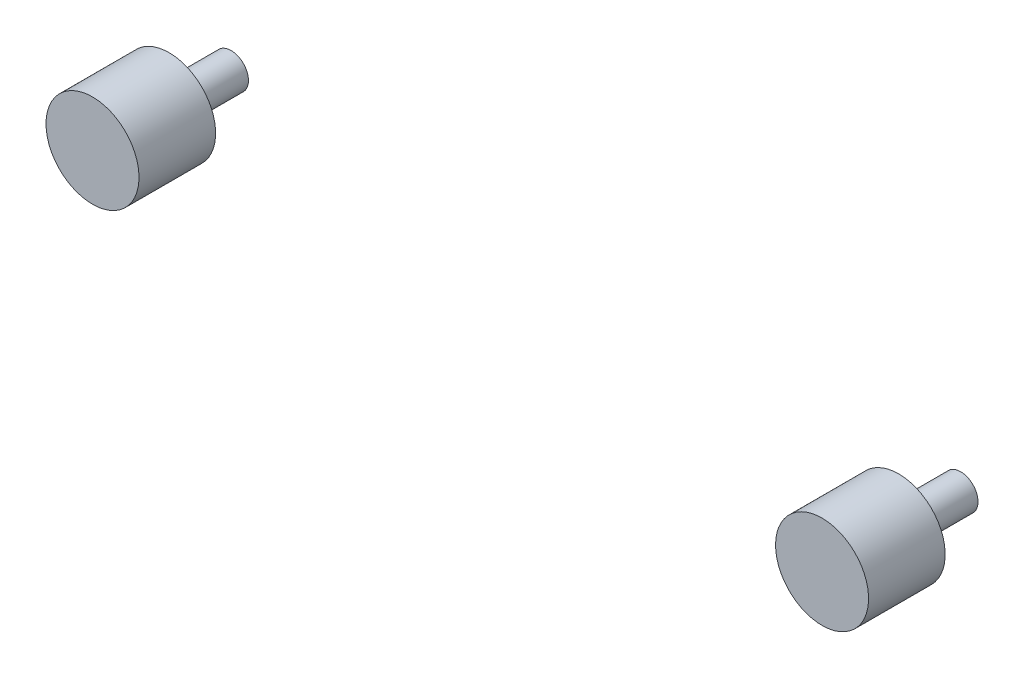
ISO-10303-21;
HEADER;
FILE_DESCRIPTION(('STEP AP214'),'2;1');
FILE_NAME('part.step','',(''),(''),'','','');
FILE_SCHEMA(('AUTOMOTIVE_DESIGN { 1 0 10303 214 1 1 1 1 }'));
ENDSEC;
DATA;
#1=APPLICATION_CONTEXT('core data for automotive mechanical design processes');
#2=APPLICATION_PROTOCOL_DEFINITION('international standard','automotive_design',2000,#1);
#3=PRODUCT_CONTEXT('',#1,'mechanical');
#4=PRODUCT('Part','Part','',(#3));
#5=PRODUCT_RELATED_PRODUCT_CATEGORY('part','',(#4));
#6=PRODUCT_DEFINITION_FORMATION('','',#4);
#7=PRODUCT_DEFINITION_CONTEXT('part definition',#1,'design');
#8=PRODUCT_DEFINITION('design','',#6,#7);
#9=PRODUCT_DEFINITION_SHAPE('','',#8);
#10=(LENGTH_UNIT() NAMED_UNIT(*) SI_UNIT(.MILLI.,.METRE.));
#11=(NAMED_UNIT(*) PLANE_ANGLE_UNIT() SI_UNIT($,.RADIAN.));
#12=(NAMED_UNIT(*) SI_UNIT($,.STERADIAN.) SOLID_ANGLE_UNIT());
#13=UNCERTAINTY_MEASURE_WITH_UNIT(LENGTH_MEASURE(1.E-05),#10,'distance_accuracy_value','');
#14=(GEOMETRIC_REPRESENTATION_CONTEXT(3) GLOBAL_UNCERTAINTY_ASSIGNED_CONTEXT((#13)) GLOBAL_UNIT_ASSIGNED_CONTEXT((#10,
#11,#12)) REPRESENTATION_CONTEXT('',''));
#15=CARTESIAN_POINT('',(0.,0.,0.));
#16=DIRECTION('',(0.,0.,1.));
#17=DIRECTION('',(1.,0.,0.));
#18=AXIS2_PLACEMENT_3D('',#15,#16,#17);
#19=CARTESIAN_POINT('',(100.,60.,21.));
#20=DIRECTION('',(0.,0.,-1.));
#21=DIRECTION('',(-1.,0.,0.));
#22=AXIS2_PLACEMENT_3D('',#19,#20,#21);
#23=CYLINDRICAL_SURFACE('',#22,12.75);
#24=CARTESIAN_POINT('',(100.,60.,21.));
#25=DIRECTION('',(0.,0.,1.));
#26=DIRECTION('',(1.,0.,0.));
#27=AXIS2_PLACEMENT_3D('',#24,#25,#26);
#28=CIRCLE('',#27,12.75);
#29=CARTESIAN_POINT('',(87.25,60.,21.));
#30=VERTEX_POINT('',#29);
#31=EDGE_CURVE('E51',#30,#30,#28,.T.);
#32=CARTESIAN_POINT('',(100.,60.,0.));
#33=DIRECTION('',(0.,0.,1.));
#34=DIRECTION('',(1.,0.,0.));
#35=AXIS2_PLACEMENT_3D('',#32,#33,#34);
#36=CIRCLE('',#35,12.75);
#37=CARTESIAN_POINT('',(87.25,60.,0.));
#38=VERTEX_POINT('',#37);
#39=EDGE_CURVE('E11',#38,#38,#36,.T.);
#40=CARTESIAN_POINT('',(87.25,60.,21.));
#41=CARTESIAN_POINT('',(87.25,60.,20.78125));
#42=CARTESIAN_POINT('',(87.25,60.,20.5625));
#43=CARTESIAN_POINT('',(87.25,60.,20.125));
#44=CARTESIAN_POINT('',(87.25,60.,19.90625));
#45=CARTESIAN_POINT('',(87.25,60.,19.46875));
#46=CARTESIAN_POINT('',(87.25,60.,19.25));
#47=CARTESIAN_POINT('',(87.25,60.,18.8125));
#48=CARTESIAN_POINT('',(87.25,60.,18.59375));
#49=CARTESIAN_POINT('',(87.25,60.,18.15625));
#50=CARTESIAN_POINT('',(87.25,60.,17.9375));
#51=CARTESIAN_POINT('',(87.25,60.,17.5));
#52=CARTESIAN_POINT('',(87.25,60.,17.28125));
#53=CARTESIAN_POINT('',(87.25,60.,16.84375));
#54=CARTESIAN_POINT('',(87.25,60.,16.625));
#55=CARTESIAN_POINT('',(87.25,60.,16.1875));
#56=CARTESIAN_POINT('',(87.25,60.,15.96875));
#57=CARTESIAN_POINT('',(87.25,60.,15.53125));
#58=CARTESIAN_POINT('',(87.25,60.,15.3125));
#59=CARTESIAN_POINT('',(87.25,60.,14.875));
#60=CARTESIAN_POINT('',(87.25,60.,14.65625));
#61=CARTESIAN_POINT('',(87.25,60.,14.21875));
#62=CARTESIAN_POINT('',(87.25,60.,14.));
#63=CARTESIAN_POINT('',(87.25,60.,13.5625));
#64=CARTESIAN_POINT('',(87.25,60.,13.34375));
#65=CARTESIAN_POINT('',(87.25,60.,12.90625));
#66=CARTESIAN_POINT('',(87.25,60.,12.6875));
#67=CARTESIAN_POINT('',(87.25,60.,12.25));
#68=CARTESIAN_POINT('',(87.25,60.,12.03125));
#69=CARTESIAN_POINT('',(87.25,60.,11.59375));
#70=CARTESIAN_POINT('',(87.25,60.,11.375));
#71=CARTESIAN_POINT('',(87.25,60.,10.9375));
#72=CARTESIAN_POINT('',(87.25,60.,10.71875));
#73=CARTESIAN_POINT('',(87.25,60.,10.28125));
#74=CARTESIAN_POINT('',(87.25,60.,10.0625));
#75=CARTESIAN_POINT('',(87.25,60.,9.625));
#76=CARTESIAN_POINT('',(87.25,60.,9.40625));
#77=CARTESIAN_POINT('',(87.25,60.,8.96875));
#78=CARTESIAN_POINT('',(87.25,60.,8.75));
#79=CARTESIAN_POINT('',(87.25,60.,8.3125));
#80=CARTESIAN_POINT('',(87.25,60.,8.09375));
#81=CARTESIAN_POINT('',(87.25,60.,7.65625));
#82=CARTESIAN_POINT('',(87.25,60.,7.4375));
#83=CARTESIAN_POINT('',(87.25,60.,7.));
#84=CARTESIAN_POINT('',(87.25,60.,6.78125));
#85=CARTESIAN_POINT('',(87.25,60.,6.34375));
#86=CARTESIAN_POINT('',(87.25,60.,6.125));
#87=CARTESIAN_POINT('',(87.25,60.,5.6875));
#88=CARTESIAN_POINT('',(87.25,60.,5.46875));
#89=CARTESIAN_POINT('',(87.25,60.,5.03125));
#90=CARTESIAN_POINT('',(87.25,60.,4.8125));
#91=CARTESIAN_POINT('',(87.25,60.,4.375));
#92=CARTESIAN_POINT('',(87.25,60.,4.15625));
#93=CARTESIAN_POINT('',(87.25,60.,3.71875));
#94=CARTESIAN_POINT('',(87.25,60.,3.5));
#95=CARTESIAN_POINT('',(87.25,60.,3.0625));
#96=CARTESIAN_POINT('',(87.25,60.,2.84375));
#97=CARTESIAN_POINT('',(87.25,60.,2.40625));
#98=CARTESIAN_POINT('',(87.25,60.,2.1875));
#99=CARTESIAN_POINT('',(87.25,60.,1.75));
#100=CARTESIAN_POINT('',(87.25,60.,1.53125));
#101=CARTESIAN_POINT('',(87.25,60.,1.09375));
#102=CARTESIAN_POINT('',(87.25,60.,0.875000000000001));
#103=CARTESIAN_POINT('',(87.25,60.,0.4375));
#104=CARTESIAN_POINT('',(87.25,60.,0.21875));
#105=CARTESIAN_POINT('',(87.25,60.,0.));
#106=B_SPLINE_CURVE_WITH_KNOTS('',3,(#40,#41,#42,#43,#44,#45,#46,#47,#48,#49,#50,#51,#52,#53,
#54,#55,#56,#57,#58,#59,#60,#61,#62,#63,#64,#65,#66,#67,#68,#69,#70,#71,#72,#73,#74,#75,#76,#77,
#78,#79,#80,#81,#82,#83,#84,#85,#86,#87,#88,#89,#90,#91,#92,#93,#94,#95,#96,#97,#98,#99,#100,
#101,#102,#103,#104,#105),.UNSPECIFIED.,.F.,.F.,(4,2,2,2,2,2,2,2,2,2,2,2,2,2,2,2,2,2,2,2,2,2,2,
2,2,2,2,2,2,2,2,2,4),(0.,0.656249999999997,1.3125,1.96875,2.625,3.28125,3.9375,4.59375,5.25,
5.90625,6.5625,7.21875,7.875,8.53125,9.1875,9.84375,10.5,11.15625,11.8125,12.46875,13.125,
13.78125,14.4375,15.09375,15.75,16.40625,17.0625,17.71875,18.375,19.03125,19.6875,20.34375,21.),.UNSPECIFIED.);
#107=EDGE_CURVE('BSEAM50',#30,#38,#106,.T.);
#108=ORIENTED_EDGE('',*,*,#31,.F.);
#109=ORIENTED_EDGE('',*,*,#39,.T.);
#110=ORIENTED_EDGE('',*,*,#107,.T.);
#111=ORIENTED_EDGE('',*,*,#107,.F.);
#112=EDGE_LOOP('',(#108,#110,#109,#111));
#113=FACE_BOUND('',#112,.T.);
#114=ADVANCED_FACE('F50',(#113),#23,.T.);
#115=CARTESIAN_POINT('',(100.,60.,21.));
#116=DIRECTION('',(0.,0.,1.));
#117=DIRECTION('',(1.,0.,0.));
#118=AXIS2_PLACEMENT_3D('',#115,#116,#117);
#119=PLANE('',#118);
#120=ORIENTED_EDGE('',*,*,#31,.T.);
#121=EDGE_LOOP('',(#120));
#122=FACE_BOUND('',#121,.T.);
#123=ADVANCED_FACE('F47',(#122),#119,.T.);
#124=CARTESIAN_POINT('',(100.,60.,0.));
#125=DIRECTION('',(0.,0.,1.));
#126=DIRECTION('',(1.,0.,0.));
#127=AXIS2_PLACEMENT_3D('',#124,#125,#126);
#128=PLANE('',#127);
#129=CARTESIAN_POINT('',(100.,60.,0.));
#130=DIRECTION('',(0.,0.,1.));
#131=DIRECTION('',(1.,0.,0.));
#132=AXIS2_PLACEMENT_3D('',#129,#130,#131);
#133=CIRCLE('',#132,4.75);
#134=CARTESIAN_POINT('',(104.75,60.,0.));
#135=VERTEX_POINT('',#134);
#136=EDGE_CURVE('E58',#135,#135,#133,.T.);
#137=ORIENTED_EDGE('',*,*,#136,.T.);
#138=EDGE_LOOP('',(#137));
#139=FACE_BOUND('',#138,.T.);
#140=ORIENTED_EDGE('',*,*,#39,.F.);
#141=EDGE_LOOP('',(#140));
#142=FACE_BOUND('',#141,.T.);
#143=ADVANCED_FACE('F71',(#139,#142),#128,.F.);
#144=CARTESIAN_POINT('',(100.,60.,0.));
#145=DIRECTION('',(0.,0.,-1.));
#146=DIRECTION('',(-1.,0.,0.));
#147=AXIS2_PLACEMENT_3D('',#144,#145,#146);
#148=CYLINDRICAL_SURFACE('',#147,4.75);
#149=ORIENTED_EDGE('',*,*,#136,.F.);
#150=EDGE_LOOP('',(#149));
#151=FACE_BOUND('',#150,.T.);
#152=CARTESIAN_POINT('',(100.,60.,-17.));
#153=DIRECTION('',(0.,0.,1.));
#154=DIRECTION('',(1.,0.,0.));
#155=AXIS2_PLACEMENT_3D('',#152,#153,#154);
#156=CIRCLE('',#155,4.75);
#157=CARTESIAN_POINT('',(104.75,60.,-17.));
#158=VERTEX_POINT('',#157);
#159=EDGE_CURVE('E59',#158,#158,#156,.T.);
#160=ORIENTED_EDGE('',*,*,#159,.T.);
#161=EDGE_LOOP('',(#160));
#162=FACE_BOUND('',#161,.T.);
#163=ADVANCED_FACE('F67',(#151,#162),#148,.T.);
#164=CARTESIAN_POINT('',(100.,60.,-17.));
#165=DIRECTION('',(0.,0.,1.));
#166=DIRECTION('',(1.,0.,0.));
#167=AXIS2_PLACEMENT_3D('',#164,#165,#166);
#168=PLANE('',#167);
#169=ORIENTED_EDGE('',*,*,#159,.F.);
#170=EDGE_LOOP('',(#169));
#171=FACE_BOUND('',#170,.T.);
#172=ADVANCED_FACE('F68',(#171),#168,.F.);
#173=CLOSED_SHELL('',(#114,#123,#143,#163,#172));
#174=MANIFOLD_SOLID_BREP('B2',#173);
#175=CARTESIAN_POINT('',(-100.,60.,21.));
#176=DIRECTION('',(0.,0.,-1.));
#177=DIRECTION('',(-1.,0.,0.));
#178=AXIS2_PLACEMENT_3D('',#175,#176,#177);
#179=CYLINDRICAL_SURFACE('',#178,12.75);
#180=CARTESIAN_POINT('',(-100.,60.,21.));
#181=DIRECTION('',(0.,0.,1.));
#182=DIRECTION('',(1.,0.,0.));
#183=AXIS2_PLACEMENT_3D('',#180,#181,#182);
#184=CIRCLE('',#183,12.75);
#185=CARTESIAN_POINT('',(-112.75,60.,21.));
#186=VERTEX_POINT('',#185);
#187=EDGE_CURVE('E46',#186,#186,#184,.T.);
#188=CARTESIAN_POINT('',(-100.,60.,0.));
#189=DIRECTION('',(0.,0.,1.));
#190=DIRECTION('',(1.,0.,0.));
#191=AXIS2_PLACEMENT_3D('',#188,#189,#190);
#192=CIRCLE('',#191,12.75);
#193=CARTESIAN_POINT('',(-112.75,60.,0.));
#194=VERTEX_POINT('',#193);
#195=EDGE_CURVE('E122',#194,#194,#192,.T.);
#196=CARTESIAN_POINT('',(-112.75,60.,21.));
#197=CARTESIAN_POINT('',(-112.75,60.,20.78125));
#198=CARTESIAN_POINT('',(-112.75,60.,20.5625));
#199=CARTESIAN_POINT('',(-112.75,60.,20.125));
#200=CARTESIAN_POINT('',(-112.75,60.,19.90625));
#201=CARTESIAN_POINT('',(-112.75,60.,19.46875));
#202=CARTESIAN_POINT('',(-112.75,60.,19.25));
#203=CARTESIAN_POINT('',(-112.75,60.,18.8125));
#204=CARTESIAN_POINT('',(-112.75,60.,18.59375));
#205=CARTESIAN_POINT('',(-112.75,60.,18.15625));
#206=CARTESIAN_POINT('',(-112.75,60.,17.9375));
#207=CARTESIAN_POINT('',(-112.75,60.,17.5));
#208=CARTESIAN_POINT('',(-112.75,60.,17.28125));
#209=CARTESIAN_POINT('',(-112.75,60.,16.84375));
#210=CARTESIAN_POINT('',(-112.75,60.,16.625));
#211=CARTESIAN_POINT('',(-112.75,60.,16.1875));
#212=CARTESIAN_POINT('',(-112.75,60.,15.96875));
#213=CARTESIAN_POINT('',(-112.75,60.,15.53125));
#214=CARTESIAN_POINT('',(-112.75,60.,15.3125));
#215=CARTESIAN_POINT('',(-112.75,60.,14.875));
#216=CARTESIAN_POINT('',(-112.75,60.,14.65625));
#217=CARTESIAN_POINT('',(-112.75,60.,14.21875));
#218=CARTESIAN_POINT('',(-112.75,60.,14.));
#219=CARTESIAN_POINT('',(-112.75,60.,13.5625));
#220=CARTESIAN_POINT('',(-112.75,60.,13.34375));
#221=CARTESIAN_POINT('',(-112.75,60.,12.90625));
#222=CARTESIAN_POINT('',(-112.75,60.,12.6875));
#223=CARTESIAN_POINT('',(-112.75,60.,12.25));
#224=CARTESIAN_POINT('',(-112.75,60.,12.03125));
#225=CARTESIAN_POINT('',(-112.75,60.,11.59375));
#226=CARTESIAN_POINT('',(-112.75,60.,11.375));
#227=CARTESIAN_POINT('',(-112.75,60.,10.9375));
#228=CARTESIAN_POINT('',(-112.75,60.,10.71875));
#229=CARTESIAN_POINT('',(-112.75,60.,10.28125));
#230=CARTESIAN_POINT('',(-112.75,60.,10.0625));
#231=CARTESIAN_POINT('',(-112.75,60.,9.625));
#232=CARTESIAN_POINT('',(-112.75,60.,9.40625));
#233=CARTESIAN_POINT('',(-112.75,60.,8.96875));
#234=CARTESIAN_POINT('',(-112.75,60.,8.75));
#235=CARTESIAN_POINT('',(-112.75,60.,8.3125));
#236=CARTESIAN_POINT('',(-112.75,60.,8.09375));
#237=CARTESIAN_POINT('',(-112.75,60.,7.65625));
#238=CARTESIAN_POINT('',(-112.75,60.,7.4375));
#239=CARTESIAN_POINT('',(-112.75,60.,7.));
#240=CARTESIAN_POINT('',(-112.75,60.,6.78125));
#241=CARTESIAN_POINT('',(-112.75,60.,6.34375));
#242=CARTESIAN_POINT('',(-112.75,60.,6.125));
#243=CARTESIAN_POINT('',(-112.75,60.,5.6875));
#244=CARTESIAN_POINT('',(-112.75,60.,5.46875));
#245=CARTESIAN_POINT('',(-112.75,60.,5.03125));
#246=CARTESIAN_POINT('',(-112.75,60.,4.8125));
#247=CARTESIAN_POINT('',(-112.75,60.,4.375));
#248=CARTESIAN_POINT('',(-112.75,60.,4.15625));
#249=CARTESIAN_POINT('',(-112.75,60.,3.71875));
#250=CARTESIAN_POINT('',(-112.75,60.,3.5));
#251=CARTESIAN_POINT('',(-112.75,60.,3.0625));
#252=CARTESIAN_POINT('',(-112.75,60.,2.84375));
#253=CARTESIAN_POINT('',(-112.75,60.,2.40625));
#254=CARTESIAN_POINT('',(-112.75,60.,2.1875));
#255=CARTESIAN_POINT('',(-112.75,60.,1.75));
#256=CARTESIAN_POINT('',(-112.75,60.,1.53125));
#257=CARTESIAN_POINT('',(-112.75,60.,1.09375));
#258=CARTESIAN_POINT('',(-112.75,60.,0.875000000000001));
#259=CARTESIAN_POINT('',(-112.75,60.,0.4375));
#260=CARTESIAN_POINT('',(-112.75,60.,0.21875));
#261=CARTESIAN_POINT('',(-112.75,60.,0.));
#262=B_SPLINE_CURVE_WITH_KNOTS('',3,(#196,#197,#198,#199,#200,#201,#202,#203,#204,#205,#206,
#207,#208,#209,#210,#211,#212,#213,#214,#215,#216,#217,#218,#219,#220,#221,#222,#223,#224,#225,
#226,#227,#228,#229,#230,#231,#232,#233,#234,#235,#236,#237,#238,#239,#240,#241,#242,#243,#244,
#245,#246,#247,#248,#249,#250,#251,#252,#253,#254,#255,#256,#257,#258,#259,#260,#261),
.UNSPECIFIED.,.F.,.F.,(4,2,2,2,2,2,2,2,2,2,2,2,2,2,2,2,2,2,2,2,2,2,2,2,2,2,2,2,2,2,2,2,4),(0.,
0.656249999999997,1.3125,1.96875,2.625,3.28125,3.9375,4.59375,5.25,5.90625,6.5625,7.21875,7.875,
8.53125,9.1875,9.84375,10.5,11.15625,11.8125,12.46875,13.125,13.78125,14.4375,15.09375,15.75,
16.40625,17.0625,17.71875,18.375,19.03125,19.6875,20.34375,21.),.UNSPECIFIED.);
#263=EDGE_CURVE('BSEAM117',#186,#194,#262,.T.);
#264=ORIENTED_EDGE('',*,*,#187,.F.);
#265=ORIENTED_EDGE('',*,*,#195,.T.);
#266=ORIENTED_EDGE('',*,*,#263,.T.);
#267=ORIENTED_EDGE('',*,*,#263,.F.);
#268=EDGE_LOOP('',(#264,#266,#265,#267));
#269=FACE_BOUND('',#268,.T.);
#270=ADVANCED_FACE('F117',(#269),#179,.T.);
#271=CARTESIAN_POINT('',(-100.,60.,21.));
#272=DIRECTION('',(0.,0.,1.));
#273=DIRECTION('',(1.,0.,0.));
#274=AXIS2_PLACEMENT_3D('',#271,#272,#273);
#275=PLANE('',#274);
#276=ORIENTED_EDGE('',*,*,#187,.T.);
#277=EDGE_LOOP('',(#276));
#278=FACE_BOUND('',#277,.T.);
#279=ADVANCED_FACE('F152',(#278),#275,.T.);
#280=CARTESIAN_POINT('',(-100.,60.,0.));
#281=DIRECTION('',(0.,0.,1.));
#282=DIRECTION('',(1.,0.,0.));
#283=AXIS2_PLACEMENT_3D('',#280,#281,#282);
#284=PLANE('',#283);
#285=CARTESIAN_POINT('',(-100.,60.,0.));
#286=DIRECTION('',(0.,0.,1.));
#287=DIRECTION('',(1.,0.,0.));
#288=AXIS2_PLACEMENT_3D('',#285,#286,#287);
#289=CIRCLE('',#288,4.75);
#290=CARTESIAN_POINT('',(-95.25,60.,0.));
#291=VERTEX_POINT('',#290);
#292=EDGE_CURVE('E127',#291,#291,#289,.T.);
#293=ORIENTED_EDGE('',*,*,#292,.T.);
#294=EDGE_LOOP('',(#293));
#295=FACE_BOUND('',#294,.T.);
#296=ORIENTED_EDGE('',*,*,#195,.F.);
#297=EDGE_LOOP('',(#296));
#298=FACE_BOUND('',#297,.T.);
#299=ADVANCED_FACE('F137',(#295,#298),#284,.F.);
#300=CARTESIAN_POINT('',(-100.,60.,0.));
#301=DIRECTION('',(0.,0.,-1.));
#302=DIRECTION('',(-1.,0.,0.));
#303=AXIS2_PLACEMENT_3D('',#300,#301,#302);
#304=CYLINDRICAL_SURFACE('',#303,4.75);
#305=ORIENTED_EDGE('',*,*,#292,.F.);
#306=EDGE_LOOP('',(#305));
#307=FACE_BOUND('',#306,.T.);
#308=CARTESIAN_POINT('',(-100.,60.,-17.));
#309=DIRECTION('',(0.,0.,1.));
#310=DIRECTION('',(1.,0.,0.));
#311=AXIS2_PLACEMENT_3D('',#308,#309,#310);
#312=CIRCLE('',#311,4.75);
#313=CARTESIAN_POINT('',(-95.25,60.,-17.));
#314=VERTEX_POINT('',#313);
#315=EDGE_CURVE('E126',#314,#314,#312,.T.);
#316=ORIENTED_EDGE('',*,*,#315,.T.);
#317=EDGE_LOOP('',(#316));
#318=FACE_BOUND('',#317,.T.);
#319=ADVANCED_FACE('F136',(#307,#318),#304,.T.);
#320=CARTESIAN_POINT('',(-100.,60.,-17.));
#321=DIRECTION('',(0.,0.,1.));
#322=DIRECTION('',(1.,0.,0.));
#323=AXIS2_PLACEMENT_3D('',#320,#321,#322);
#324=PLANE('',#323);
#325=ORIENTED_EDGE('',*,*,#315,.F.);
#326=EDGE_LOOP('',(#325));
#327=FACE_BOUND('',#326,.T.);
#328=ADVANCED_FACE('F145',(#327),#324,.F.);
#329=CLOSED_SHELL('',(#270,#279,#299,#319,#328));
#330=MANIFOLD_SOLID_BREP('B6',#329);
#331=ADVANCED_BREP_SHAPE_REPRESENTATION('',(#18,#174,#330),#14);
#332=SHAPE_DEFINITION_REPRESENTATION(#9,#331);
ENDSEC;
END-ISO-10303-21;
